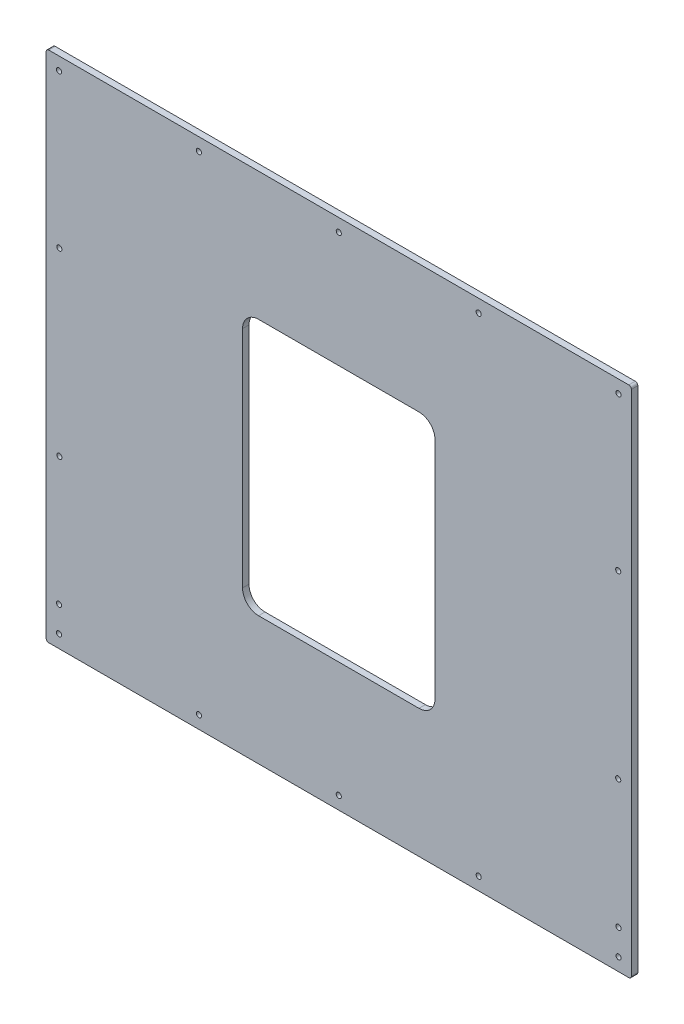
ISO-10303-21;
HEADER;
FILE_DESCRIPTION(('STEP AP214'),'2;1');
FILE_NAME('part.step','',(''),(''),'','','');
FILE_SCHEMA(('AUTOMOTIVE_DESIGN { 1 0 10303 214 1 1 1 1 }'));
ENDSEC;
DATA;
#1=APPLICATION_CONTEXT('core data for automotive mechanical design processes');
#2=APPLICATION_PROTOCOL_DEFINITION('international standard','automotive_design',2000,#1);
#3=PRODUCT_CONTEXT('',#1,'mechanical');
#4=PRODUCT('Part','Part','',(#3));
#5=PRODUCT_RELATED_PRODUCT_CATEGORY('part','',(#4));
#6=PRODUCT_DEFINITION_FORMATION('','',#4);
#7=PRODUCT_DEFINITION_CONTEXT('part definition',#1,'design');
#8=PRODUCT_DEFINITION('design','',#6,#7);
#9=PRODUCT_DEFINITION_SHAPE('','',#8);
#10=(LENGTH_UNIT() NAMED_UNIT(*) SI_UNIT(.MILLI.,.METRE.));
#11=(NAMED_UNIT(*) PLANE_ANGLE_UNIT() SI_UNIT($,.RADIAN.));
#12=(NAMED_UNIT(*) SI_UNIT($,.STERADIAN.) SOLID_ANGLE_UNIT());
#13=UNCERTAINTY_MEASURE_WITH_UNIT(LENGTH_MEASURE(1.E-05),#10,'distance_accuracy_value','');
#14=(GEOMETRIC_REPRESENTATION_CONTEXT(3) GLOBAL_UNCERTAINTY_ASSIGNED_CONTEXT((#13)) GLOBAL_UNIT_ASSIGNED_CONTEXT((#10,
#11,#12)) REPRESENTATION_CONTEXT('',''));
#15=CARTESIAN_POINT('',(0.,0.,0.));
#16=DIRECTION('',(0.,0.,1.));
#17=DIRECTION('',(1.,0.,0.));
#18=AXIS2_PLACEMENT_3D('',#15,#16,#17);
#19=CARTESIAN_POINT('',(-452.,396.,10.));
#20=DIRECTION('',(0.,0.,-1.));
#21=DIRECTION('',(-1.,0.,0.));
#22=AXIS2_PLACEMENT_3D('',#19,#20,#21);
#23=PLANE('',#22);
#24=DIRECTION('',(0.,-1.,0.));
#25=VECTOR('',#24,1.);
#26=CARTESIAN_POINT('',(-150.,-175.,10.));
#27=LINE('',#26,#25);
#28=CARTESIAN_POINT('',(-150.,175.,10.));
#29=VERTEX_POINT('',#28);
#30=CARTESIAN_POINT('',(-150.,-175.,10.));
#31=VERTEX_POINT('',#30);
#32=EDGE_CURVE('E184',#29,#31,#27,.T.);
#33=ORIENTED_EDGE('',*,*,#32,.F.);
#34=CARTESIAN_POINT('',(-125.,175.,10.));
#35=DIRECTION('',(0.,0.,1.));
#36=DIRECTION('',(1.,0.,0.));
#37=AXIS2_PLACEMENT_3D('',#34,#35,#36);
#38=CIRCLE('',#37,25.);
#39=CARTESIAN_POINT('',(-125.,200.,10.));
#40=VERTEX_POINT('',#39);
#41=EDGE_CURVE('E47',#40,#29,#38,.T.);
#42=ORIENTED_EDGE('',*,*,#41,.F.);
#43=DIRECTION('',(-1.,0.,0.));
#44=VECTOR('',#43,1.);
#45=CARTESIAN_POINT('',(-125.,200.,10.));
#46=LINE('',#45,#44);
#47=CARTESIAN_POINT('',(125.,200.,10.));
#48=VERTEX_POINT('',#47);
#49=EDGE_CURVE('E164',#48,#40,#46,.T.);
#50=ORIENTED_EDGE('',*,*,#49,.F.);
#51=CARTESIAN_POINT('',(125.,175.,10.));
#52=DIRECTION('',(0.,0.,1.));
#53=DIRECTION('',(-1.,0.,0.));
#54=AXIS2_PLACEMENT_3D('',#51,#52,#53);
#55=CIRCLE('',#54,25.);
#56=CARTESIAN_POINT('',(150.,175.,10.));
#57=VERTEX_POINT('',#56);
#58=EDGE_CURVE('E167',#57,#48,#55,.T.);
#59=ORIENTED_EDGE('',*,*,#58,.F.);
#60=DIRECTION('',(0.,1.,0.));
#61=VECTOR('',#60,1.);
#62=CARTESIAN_POINT('',(150.,-175.,10.));
#63=LINE('',#62,#61);
#64=CARTESIAN_POINT('',(150.,-175.,10.));
#65=VERTEX_POINT('',#64);
#66=EDGE_CURVE('E195',#65,#57,#63,.T.);
#67=ORIENTED_EDGE('',*,*,#66,.F.);
#68=CARTESIAN_POINT('',(125.,-175.,10.));
#69=DIRECTION('',(0.,0.,1.));
#70=DIRECTION('',(-1.,0.,0.));
#71=AXIS2_PLACEMENT_3D('',#68,#69,#70);
#72=CIRCLE('',#71,25.);
#73=CARTESIAN_POINT('',(125.,-200.,10.));
#74=VERTEX_POINT('',#73);
#75=EDGE_CURVE('E192',#74,#65,#72,.T.);
#76=ORIENTED_EDGE('',*,*,#75,.F.);
#77=DIRECTION('',(1.,0.,0.));
#78=VECTOR('',#77,1.);
#79=CARTESIAN_POINT('',(-125.,-200.,10.));
#80=LINE('',#79,#78);
#81=CARTESIAN_POINT('',(-125.,-200.,10.));
#82=VERTEX_POINT('',#81);
#83=EDGE_CURVE('E189',#82,#74,#80,.T.);
#84=ORIENTED_EDGE('',*,*,#83,.F.);
#85=CARTESIAN_POINT('',(-125.,-175.,10.));
#86=DIRECTION('',(0.,0.,1.));
#87=DIRECTION('',(1.,0.,0.));
#88=AXIS2_PLACEMENT_3D('',#85,#86,#87);
#89=CIRCLE('',#88,25.);
#90=EDGE_CURVE('E186',#31,#82,#89,.T.);
#91=ORIENTED_EDGE('',*,*,#90,.F.);
#92=EDGE_LOOP('',(#33,#42,#50,#59,#67,#76,#84,#91));
#93=FACE_BOUND('',#92,.T.);
#94=CARTESIAN_POINT('',(-452.,396.,10.));
#95=DIRECTION('',(0.,0.,1.));
#96=DIRECTION('',(-1.,0.,0.));
#97=AXIS2_PLACEMENT_3D('',#94,#95,#96);
#98=CIRCLE('',#97,4.);
#99=CARTESIAN_POINT('',(-452.,400.,10.));
#100=VERTEX_POINT('',#99);
#101=CARTESIAN_POINT('',(-456.,396.,10.));
#102=VERTEX_POINT('',#101);
#103=EDGE_CURVE('E310',#100,#102,#98,.T.);
#104=ORIENTED_EDGE('',*,*,#103,.T.);
#105=DIRECTION('',(0.,-1.,0.));
#106=VECTOR('',#105,1.);
#107=CARTESIAN_POINT('',(-456.,-396.,10.));
#108=LINE('',#107,#106);
#109=CARTESIAN_POINT('',(-456.,-396.,10.));
#110=VERTEX_POINT('',#109);
#111=EDGE_CURVE('E313',#102,#110,#108,.T.);
#112=ORIENTED_EDGE('',*,*,#111,.T.);
#113=CARTESIAN_POINT('',(-452.,-396.,10.));
#114=DIRECTION('',(0.,0.,1.));
#115=DIRECTION('',(1.,0.,0.));
#116=AXIS2_PLACEMENT_3D('',#113,#114,#115);
#117=CIRCLE('',#116,4.);
#118=CARTESIAN_POINT('',(-452.,-400.,10.));
#119=VERTEX_POINT('',#118);
#120=EDGE_CURVE('E316',#110,#119,#117,.T.);
#121=ORIENTED_EDGE('',*,*,#120,.T.);
#122=DIRECTION('',(1.,0.,0.));
#123=VECTOR('',#122,1.);
#124=CARTESIAN_POINT('',(-452.,-400.,10.));
#125=LINE('',#124,#123);
#126=CARTESIAN_POINT('',(452.,-400.,10.));
#127=VERTEX_POINT('',#126);
#128=EDGE_CURVE('E318',#119,#127,#125,.T.);
#129=ORIENTED_EDGE('',*,*,#128,.T.);
#130=CARTESIAN_POINT('',(452.,-396.,10.));
#131=DIRECTION('',(0.,0.,1.));
#132=DIRECTION('',(1.,0.,0.));
#133=AXIS2_PLACEMENT_3D('',#130,#131,#132);
#134=CIRCLE('',#133,4.);
#135=CARTESIAN_POINT('',(456.,-396.,10.));
#136=VERTEX_POINT('',#135);
#137=EDGE_CURVE('E320',#127,#136,#134,.T.);
#138=ORIENTED_EDGE('',*,*,#137,.T.);
#139=DIRECTION('',(0.,1.,0.));
#140=VECTOR('',#139,1.);
#141=CARTESIAN_POINT('',(456.,-396.,10.));
#142=LINE('',#141,#140);
#143=CARTESIAN_POINT('',(456.,396.,10.));
#144=VERTEX_POINT('',#143);
#145=EDGE_CURVE('E322',#136,#144,#142,.T.);
#146=ORIENTED_EDGE('',*,*,#145,.T.);
#147=CARTESIAN_POINT('',(452.,396.,10.));
#148=DIRECTION('',(0.,0.,1.));
#149=DIRECTION('',(1.,0.,0.));
#150=AXIS2_PLACEMENT_3D('',#147,#148,#149);
#151=CIRCLE('',#150,4.);
#152=CARTESIAN_POINT('',(452.,400.,10.));
#153=VERTEX_POINT('',#152);
#154=EDGE_CURVE('E324',#144,#153,#151,.T.);
#155=ORIENTED_EDGE('',*,*,#154,.T.);
#156=DIRECTION('',(-1.,0.,0.));
#157=VECTOR('',#156,1.);
#158=CARTESIAN_POINT('',(-452.,400.,10.));
#159=LINE('',#158,#157);
#160=EDGE_CURVE('E326',#153,#100,#159,.T.);
#161=ORIENTED_EDGE('',*,*,#160,.T.);
#162=EDGE_LOOP('',(#104,#112,#121,#129,#138,#146,#155,#161));
#163=FACE_BOUND('',#162,.T.);
#164=CARTESIAN_POINT('',(436.,380.,10.));
#165=DIRECTION('',(0.,0.,1.));
#166=DIRECTION('',(1.,0.,0.));
#167=AXIS2_PLACEMENT_3D('',#164,#165,#166);
#168=CIRCLE('',#167,3.99999999999999);
#169=CARTESIAN_POINT('',(440.,380.,10.));
#170=VERTEX_POINT('',#169);
#171=EDGE_CURVE('E304',#170,#170,#168,.T.);
#172=ORIENTED_EDGE('',*,*,#171,.F.);
#173=EDGE_LOOP('',(#172));
#174=FACE_BOUND('',#173,.T.);
#175=CARTESIAN_POINT('',(435.5,141.,10.));
#176=DIRECTION('',(0.,0.,1.));
#177=DIRECTION('',(1.,0.,0.));
#178=AXIS2_PLACEMENT_3D('',#175,#176,#177);
#179=CIRCLE('',#178,3.99999999999999);
#180=CARTESIAN_POINT('',(439.5,141.,10.));
#181=VERTEX_POINT('',#180);
#182=EDGE_CURVE('E298',#181,#181,#179,.T.);
#183=ORIENTED_EDGE('',*,*,#182,.F.);
#184=EDGE_LOOP('',(#183));
#185=FACE_BOUND('',#184,.T.);
#186=CARTESIAN_POINT('',(435.500000000003,-140.,10.));
#187=DIRECTION('',(0.,0.,1.));
#188=DIRECTION('',(1.,0.,0.));
#189=AXIS2_PLACEMENT_3D('',#186,#187,#188);
#190=CIRCLE('',#189,3.99999999999999);
#191=CARTESIAN_POINT('',(439.500000000003,-140.,10.));
#192=VERTEX_POINT('',#191);
#193=EDGE_CURVE('E292',#192,#192,#190,.T.);
#194=ORIENTED_EDGE('',*,*,#193,.F.);
#195=EDGE_LOOP('',(#194));
#196=FACE_BOUND('',#195,.T.);
#197=CARTESIAN_POINT('',(-435.500000000003,-140.,10.));
#198=DIRECTION('',(0.,0.,1.));
#199=DIRECTION('',(-1.,0.,0.));
#200=AXIS2_PLACEMENT_3D('',#197,#198,#199);
#201=CIRCLE('',#200,3.99999999999999);
#202=CARTESIAN_POINT('',(-439.500000000003,-140.,10.));
#203=VERTEX_POINT('',#202);
#204=EDGE_CURVE('E286',#203,#203,#201,.T.);
#205=ORIENTED_EDGE('',*,*,#204,.F.);
#206=EDGE_LOOP('',(#205));
#207=FACE_BOUND('',#206,.T.);
#208=CARTESIAN_POINT('',(-436.,380.,10.));
#209=DIRECTION('',(0.,0.,1.));
#210=DIRECTION('',(-1.,0.,0.));
#211=AXIS2_PLACEMENT_3D('',#208,#209,#210);
#212=CIRCLE('',#211,3.99999999999999);
#213=CARTESIAN_POINT('',(-440.,380.,10.));
#214=VERTEX_POINT('',#213);
#215=EDGE_CURVE('E280',#214,#214,#212,.T.);
#216=ORIENTED_EDGE('',*,*,#215,.F.);
#217=EDGE_LOOP('',(#216));
#218=FACE_BOUND('',#217,.T.);
#219=CARTESIAN_POINT('',(-435.5,141.,10.));
#220=DIRECTION('',(0.,0.,1.));
#221=DIRECTION('',(-1.,0.,0.));
#222=AXIS2_PLACEMENT_3D('',#219,#220,#221);
#223=CIRCLE('',#222,3.99999999999999);
#224=CARTESIAN_POINT('',(-439.5,141.,10.));
#225=VERTEX_POINT('',#224);
#226=EDGE_CURVE('E274',#225,#225,#223,.T.);
#227=ORIENTED_EDGE('',*,*,#226,.F.);
#228=EDGE_LOOP('',(#227));
#229=FACE_BOUND('',#228,.T.);
#230=CARTESIAN_POINT('',(436.,-380.,10.));
#231=DIRECTION('',(0.,0.,1.));
#232=DIRECTION('',(-1.,0.,0.));
#233=AXIS2_PLACEMENT_3D('',#230,#231,#232);
#234=CIRCLE('',#233,3.99999999999999);
#235=CARTESIAN_POINT('',(432.,-380.,10.));
#236=VERTEX_POINT('',#235);
#237=EDGE_CURVE('E268',#236,#236,#234,.T.);
#238=ORIENTED_EDGE('',*,*,#237,.F.);
#239=EDGE_LOOP('',(#238));
#240=FACE_BOUND('',#239,.T.);
#241=CARTESIAN_POINT('',(436.,-340.,10.));
#242=DIRECTION('',(0.,0.,1.));
#243=DIRECTION('',(-1.,0.,0.));
#244=AXIS2_PLACEMENT_3D('',#241,#242,#243);
#245=CIRCLE('',#244,3.99999999999999);
#246=CARTESIAN_POINT('',(432.,-340.,10.));
#247=VERTEX_POINT('',#246);
#248=EDGE_CURVE('E262',#247,#247,#245,.T.);
#249=ORIENTED_EDGE('',*,*,#248,.F.);
#250=EDGE_LOOP('',(#249));
#251=FACE_BOUND('',#250,.T.);
#252=CARTESIAN_POINT('',(-435.999999999999,-340.,10.));
#253=DIRECTION('',(0.,0.,1.));
#254=DIRECTION('',(1.,0.,0.));
#255=AXIS2_PLACEMENT_3D('',#252,#253,#254);
#256=CIRCLE('',#255,3.99999999999999);
#257=CARTESIAN_POINT('',(-431.999999999999,-340.,10.));
#258=VERTEX_POINT('',#257);
#259=EDGE_CURVE('E256',#258,#258,#256,.T.);
#260=ORIENTED_EDGE('',*,*,#259,.F.);
#261=EDGE_LOOP('',(#260));
#262=FACE_BOUND('',#261,.T.);
#263=CARTESIAN_POINT('',(-435.999999999999,-380.,10.));
#264=DIRECTION('',(0.,0.,1.));
#265=DIRECTION('',(1.,0.,0.));
#266=AXIS2_PLACEMENT_3D('',#263,#264,#265);
#267=CIRCLE('',#266,3.99999999999999);
#268=CARTESIAN_POINT('',(-431.999999999999,-380.,10.));
#269=VERTEX_POINT('',#268);
#270=EDGE_CURVE('E250',#269,#269,#267,.T.);
#271=ORIENTED_EDGE('',*,*,#270,.F.);
#272=EDGE_LOOP('',(#271));
#273=FACE_BOUND('',#272,.T.);
#274=CARTESIAN_POINT('',(-218.,380.000000000005,10.));
#275=DIRECTION('',(0.,0.,1.));
#276=DIRECTION('',(1.,0.,0.));
#277=AXIS2_PLACEMENT_3D('',#274,#275,#276);
#278=CIRCLE('',#277,3.99999999999999);
#279=CARTESIAN_POINT('',(-214.,380.000000000005,10.));
#280=VERTEX_POINT('',#279);
#281=EDGE_CURVE('E244',#280,#280,#278,.T.);
#282=ORIENTED_EDGE('',*,*,#281,.F.);
#283=EDGE_LOOP('',(#282));
#284=FACE_BOUND('',#283,.T.);
#285=CARTESIAN_POINT('',(218.,-380.000000000002,10.));
#286=DIRECTION('',(0.,0.,1.));
#287=DIRECTION('',(-1.,0.,0.));
#288=AXIS2_PLACEMENT_3D('',#285,#286,#287);
#289=CIRCLE('',#288,3.99999999999999);
#290=CARTESIAN_POINT('',(214.,-380.000000000002,10.));
#291=VERTEX_POINT('',#290);
#292=EDGE_CURVE('E238',#291,#291,#289,.T.);
#293=ORIENTED_EDGE('',*,*,#292,.F.);
#294=EDGE_LOOP('',(#293));
#295=FACE_BOUND('',#294,.T.);
#296=CARTESIAN_POINT('',(-2.22044604925031E-13,-380.000000000003,10.));
#297=DIRECTION('',(0.,0.,1.));
#298=DIRECTION('',(-1.,0.,0.));
#299=AXIS2_PLACEMENT_3D('',#296,#297,#298);
#300=CIRCLE('',#299,3.99999999999999);
#301=CARTESIAN_POINT('',(-4.00000000000021,-380.000000000003,10.));
#302=VERTEX_POINT('',#301);
#303=EDGE_CURVE('E232',#302,#302,#300,.T.);
#304=ORIENTED_EDGE('',*,*,#303,.F.);
#305=EDGE_LOOP('',(#304));
#306=FACE_BOUND('',#305,.T.);
#307=CARTESIAN_POINT('',(-218.,-380.000000000005,10.));
#308=DIRECTION('',(0.,0.,1.));
#309=DIRECTION('',(-1.,0.,0.));
#310=AXIS2_PLACEMENT_3D('',#307,#308,#309);
#311=CIRCLE('',#310,3.99999999999999);
#312=CARTESIAN_POINT('',(-222.,-380.000000000005,10.));
#313=VERTEX_POINT('',#312);
#314=EDGE_CURVE('E226',#313,#313,#311,.T.);
#315=ORIENTED_EDGE('',*,*,#314,.F.);
#316=EDGE_LOOP('',(#315));
#317=FACE_BOUND('',#316,.T.);
#318=CARTESIAN_POINT('',(-4.44089209850063E-13,380.000000000003,10.));
#319=DIRECTION('',(0.,0.,1.));
#320=DIRECTION('',(1.,0.,0.));
#321=AXIS2_PLACEMENT_3D('',#318,#319,#320);
#322=CIRCLE('',#321,3.99999999999999);
#323=CARTESIAN_POINT('',(3.99999999999955,380.000000000003,10.));
#324=VERTEX_POINT('',#323);
#325=EDGE_CURVE('E220',#324,#324,#322,.T.);
#326=ORIENTED_EDGE('',*,*,#325,.F.);
#327=EDGE_LOOP('',(#326));
#328=FACE_BOUND('',#327,.T.);
#329=CARTESIAN_POINT('',(217.999999999999,380.000000000002,10.));
#330=DIRECTION('',(0.,0.,1.));
#331=DIRECTION('',(1.,0.,0.));
#332=AXIS2_PLACEMENT_3D('',#329,#330,#331);
#333=CIRCLE('',#332,3.99999999999999);
#334=CARTESIAN_POINT('',(221.999999999999,380.000000000002,10.));
#335=VERTEX_POINT('',#334);
#336=EDGE_CURVE('E214',#335,#335,#333,.T.);
#337=ORIENTED_EDGE('',*,*,#336,.F.);
#338=EDGE_LOOP('',(#337));
#339=FACE_BOUND('',#338,.T.);
#340=ADVANCED_FACE('F32',(#93,#163,#174,#185,#196,#207,#218,#229,#240,#251,#262,#273,#284,#295,
#306,#317,#328,#339),#23,.F.);
#341=CARTESIAN_POINT('',(-452.,396.,0.));
#342=DIRECTION('',(0.,0.,-1.));
#343=DIRECTION('',(-1.,0.,0.));
#344=AXIS2_PLACEMENT_3D('',#341,#342,#343);
#345=PLANE('',#344);
#346=CARTESIAN_POINT('',(-125.,175.,0.));
#347=DIRECTION('',(0.,0.,1.));
#348=DIRECTION('',(1.,0.,0.));
#349=AXIS2_PLACEMENT_3D('',#346,#347,#348);
#350=CIRCLE('',#349,25.);
#351=CARTESIAN_POINT('',(-125.,200.,0.));
#352=VERTEX_POINT('',#351);
#353=CARTESIAN_POINT('',(-150.,175.,0.));
#354=VERTEX_POINT('',#353);
#355=EDGE_CURVE('E147',#352,#354,#350,.T.);
#356=ORIENTED_EDGE('',*,*,#355,.T.);
#357=DIRECTION('',(0.,-1.,0.));
#358=VECTOR('',#357,1.);
#359=CARTESIAN_POINT('',(-150.,-175.,0.));
#360=LINE('',#359,#358);
#361=CARTESIAN_POINT('',(-150.,-175.,0.));
#362=VERTEX_POINT('',#361);
#363=EDGE_CURVE('E156',#354,#362,#360,.T.);
#364=ORIENTED_EDGE('',*,*,#363,.T.);
#365=CARTESIAN_POINT('',(-125.,-175.,0.));
#366=DIRECTION('',(0.,0.,1.));
#367=DIRECTION('',(1.,0.,0.));
#368=AXIS2_PLACEMENT_3D('',#365,#366,#367);
#369=CIRCLE('',#368,25.);
#370=CARTESIAN_POINT('',(-125.,-200.,0.));
#371=VERTEX_POINT('',#370);
#372=EDGE_CURVE('E55',#362,#371,#369,.T.);
#373=ORIENTED_EDGE('',*,*,#372,.T.);
#374=DIRECTION('',(1.,0.,0.));
#375=VECTOR('',#374,1.);
#376=CARTESIAN_POINT('',(-125.,-200.,0.));
#377=LINE('',#376,#375);
#378=CARTESIAN_POINT('',(125.,-200.,0.));
#379=VERTEX_POINT('',#378);
#380=EDGE_CURVE('E171',#371,#379,#377,.T.);
#381=ORIENTED_EDGE('',*,*,#380,.T.);
#382=CARTESIAN_POINT('',(125.,-175.,0.));
#383=DIRECTION('',(0.,0.,1.));
#384=DIRECTION('',(-1.,0.,0.));
#385=AXIS2_PLACEMENT_3D('',#382,#383,#384);
#386=CIRCLE('',#385,25.);
#387=CARTESIAN_POINT('',(150.,-175.,0.));
#388=VERTEX_POINT('',#387);
#389=EDGE_CURVE('E174',#379,#388,#386,.T.);
#390=ORIENTED_EDGE('',*,*,#389,.T.);
#391=DIRECTION('',(0.,1.,0.));
#392=VECTOR('',#391,1.);
#393=CARTESIAN_POINT('',(150.,-175.,0.));
#394=LINE('',#393,#392);
#395=CARTESIAN_POINT('',(150.,175.,0.));
#396=VERTEX_POINT('',#395);
#397=EDGE_CURVE('E177',#388,#396,#394,.T.);
#398=ORIENTED_EDGE('',*,*,#397,.T.);
#399=CARTESIAN_POINT('',(125.,175.,0.));
#400=DIRECTION('',(0.,0.,1.));
#401=DIRECTION('',(-1.,0.,0.));
#402=AXIS2_PLACEMENT_3D('',#399,#400,#401);
#403=CIRCLE('',#402,25.);
#404=CARTESIAN_POINT('',(125.,200.,0.));
#405=VERTEX_POINT('',#404);
#406=EDGE_CURVE('E180',#396,#405,#403,.T.);
#407=ORIENTED_EDGE('',*,*,#406,.T.);
#408=DIRECTION('',(-1.,0.,0.));
#409=VECTOR('',#408,1.);
#410=CARTESIAN_POINT('',(-125.,200.,0.));
#411=LINE('',#410,#409);
#412=EDGE_CURVE('E153',#405,#352,#411,.T.);
#413=ORIENTED_EDGE('',*,*,#412,.T.);
#414=EDGE_LOOP('',(#356,#364,#373,#381,#390,#398,#407,#413));
#415=FACE_BOUND('',#414,.T.);
#416=CARTESIAN_POINT('',(-4.44089209850063E-13,380.000000000003,0.));
#417=DIRECTION('',(0.,0.,1.));
#418=DIRECTION('',(1.,0.,0.));
#419=AXIS2_PLACEMENT_3D('',#416,#417,#418);
#420=CIRCLE('',#419,3.99999999999999);
#421=CARTESIAN_POINT('',(3.99999999999955,380.000000000003,0.));
#422=VERTEX_POINT('',#421);
#423=EDGE_CURVE('E217',#422,#422,#420,.T.);
#424=ORIENTED_EDGE('',*,*,#423,.T.);
#425=EDGE_LOOP('',(#424));
#426=FACE_BOUND('',#425,.T.);
#427=CARTESIAN_POINT('',(-2.22044604925031E-13,-380.000000000003,0.));
#428=DIRECTION('',(0.,0.,1.));
#429=DIRECTION('',(-1.,0.,0.));
#430=AXIS2_PLACEMENT_3D('',#427,#428,#429);
#431=CIRCLE('',#430,3.99999999999999);
#432=CARTESIAN_POINT('',(-4.00000000000021,-380.000000000003,0.));
#433=VERTEX_POINT('',#432);
#434=EDGE_CURVE('E229',#433,#433,#431,.T.);
#435=ORIENTED_EDGE('',*,*,#434,.T.);
#436=EDGE_LOOP('',(#435));
#437=FACE_BOUND('',#436,.T.);
#438=CARTESIAN_POINT('',(-218.,380.000000000005,0.));
#439=DIRECTION('',(0.,0.,1.));
#440=DIRECTION('',(1.,0.,0.));
#441=AXIS2_PLACEMENT_3D('',#438,#439,#440);
#442=CIRCLE('',#441,3.99999999999999);
#443=CARTESIAN_POINT('',(-214.,380.000000000005,0.));
#444=VERTEX_POINT('',#443);
#445=EDGE_CURVE('E241',#444,#444,#442,.T.);
#446=ORIENTED_EDGE('',*,*,#445,.T.);
#447=EDGE_LOOP('',(#446));
#448=FACE_BOUND('',#447,.T.);
#449=CARTESIAN_POINT('',(-435.999999999999,-340.,0.));
#450=DIRECTION('',(0.,0.,1.));
#451=DIRECTION('',(1.,0.,0.));
#452=AXIS2_PLACEMENT_3D('',#449,#450,#451);
#453=CIRCLE('',#452,3.99999999999999);
#454=CARTESIAN_POINT('',(-431.999999999999,-340.,0.));
#455=VERTEX_POINT('',#454);
#456=EDGE_CURVE('E253',#455,#455,#453,.T.);
#457=ORIENTED_EDGE('',*,*,#456,.T.);
#458=EDGE_LOOP('',(#457));
#459=FACE_BOUND('',#458,.T.);
#460=CARTESIAN_POINT('',(436.,-380.,0.));
#461=DIRECTION('',(0.,0.,1.));
#462=DIRECTION('',(-1.,0.,0.));
#463=AXIS2_PLACEMENT_3D('',#460,#461,#462);
#464=CIRCLE('',#463,3.99999999999999);
#465=CARTESIAN_POINT('',(432.,-380.,0.));
#466=VERTEX_POINT('',#465);
#467=EDGE_CURVE('E265',#466,#466,#464,.T.);
#468=ORIENTED_EDGE('',*,*,#467,.T.);
#469=EDGE_LOOP('',(#468));
#470=FACE_BOUND('',#469,.T.);
#471=CARTESIAN_POINT('',(-436.,380.,0.));
#472=DIRECTION('',(0.,0.,1.));
#473=DIRECTION('',(-1.,0.,0.));
#474=AXIS2_PLACEMENT_3D('',#471,#472,#473);
#475=CIRCLE('',#474,3.99999999999999);
#476=CARTESIAN_POINT('',(-440.,380.,0.));
#477=VERTEX_POINT('',#476);
#478=EDGE_CURVE('E277',#477,#477,#475,.T.);
#479=ORIENTED_EDGE('',*,*,#478,.T.);
#480=EDGE_LOOP('',(#479));
#481=FACE_BOUND('',#480,.T.);
#482=CARTESIAN_POINT('',(435.500000000003,-140.,0.));
#483=DIRECTION('',(0.,0.,1.));
#484=DIRECTION('',(1.,0.,0.));
#485=AXIS2_PLACEMENT_3D('',#482,#483,#484);
#486=CIRCLE('',#485,3.99999999999999);
#487=CARTESIAN_POINT('',(439.500000000003,-140.,0.));
#488=VERTEX_POINT('',#487);
#489=EDGE_CURVE('E289',#488,#488,#486,.T.);
#490=ORIENTED_EDGE('',*,*,#489,.T.);
#491=EDGE_LOOP('',(#490));
#492=FACE_BOUND('',#491,.T.);
#493=CARTESIAN_POINT('',(436.,380.,0.));
#494=DIRECTION('',(0.,0.,1.));
#495=DIRECTION('',(1.,0.,0.));
#496=AXIS2_PLACEMENT_3D('',#493,#494,#495);
#497=CIRCLE('',#496,3.99999999999999);
#498=CARTESIAN_POINT('',(440.,380.,0.));
#499=VERTEX_POINT('',#498);
#500=EDGE_CURVE('E301',#499,#499,#497,.T.);
#501=ORIENTED_EDGE('',*,*,#500,.T.);
#502=EDGE_LOOP('',(#501));
#503=FACE_BOUND('',#502,.T.);
#504=CARTESIAN_POINT('',(-452.,396.,0.));
#505=DIRECTION('',(0.,0.,1.));
#506=DIRECTION('',(-1.,0.,0.));
#507=AXIS2_PLACEMENT_3D('',#504,#505,#506);
#508=CIRCLE('',#507,4.);
#509=CARTESIAN_POINT('',(-452.,400.,0.));
#510=VERTEX_POINT('',#509);
#511=CARTESIAN_POINT('',(-456.,396.,0.));
#512=VERTEX_POINT('',#511);
#513=EDGE_CURVE('E307',#510,#512,#508,.T.);
#514=ORIENTED_EDGE('',*,*,#513,.F.);
#515=DIRECTION('',(-1.,0.,0.));
#516=VECTOR('',#515,1.);
#517=CARTESIAN_POINT('',(-452.,400.,0.));
#518=LINE('',#517,#516);
#519=CARTESIAN_POINT('',(452.,400.,0.));
#520=VERTEX_POINT('',#519);
#521=EDGE_CURVE('E314',#520,#510,#518,.T.);
#522=ORIENTED_EDGE('',*,*,#521,.F.);
#523=CARTESIAN_POINT('',(452.,396.,0.));
#524=DIRECTION('',(0.,0.,1.));
#525=DIRECTION('',(1.,0.,0.));
#526=AXIS2_PLACEMENT_3D('',#523,#524,#525);
#527=CIRCLE('',#526,4.);
#528=CARTESIAN_POINT('',(456.,396.,0.));
#529=VERTEX_POINT('',#528);
#530=EDGE_CURVE('E341',#529,#520,#527,.T.);
#531=ORIENTED_EDGE('',*,*,#530,.F.);
#532=DIRECTION('',(0.,1.,0.));
#533=VECTOR('',#532,1.);
#534=CARTESIAN_POINT('',(456.,-396.,0.));
#535=LINE('',#534,#533);
#536=CARTESIAN_POINT('',(456.,-396.,0.));
#537=VERTEX_POINT('',#536);
#538=EDGE_CURVE('E339',#537,#529,#535,.T.);
#539=ORIENTED_EDGE('',*,*,#538,.F.);
#540=CARTESIAN_POINT('',(452.,-396.,0.));
#541=DIRECTION('',(0.,0.,1.));
#542=DIRECTION('',(1.,0.,0.));
#543=AXIS2_PLACEMENT_3D('',#540,#541,#542);
#544=CIRCLE('',#543,4.);
#545=CARTESIAN_POINT('',(452.,-400.,0.));
#546=VERTEX_POINT('',#545);
#547=EDGE_CURVE('E337',#546,#537,#544,.T.);
#548=ORIENTED_EDGE('',*,*,#547,.F.);
#549=DIRECTION('',(1.,0.,0.));
#550=VECTOR('',#549,1.);
#551=CARTESIAN_POINT('',(-452.,-400.,0.));
#552=LINE('',#551,#550);
#553=CARTESIAN_POINT('',(-452.,-400.,0.));
#554=VERTEX_POINT('',#553);
#555=EDGE_CURVE('E335',#554,#546,#552,.T.);
#556=ORIENTED_EDGE('',*,*,#555,.F.);
#557=CARTESIAN_POINT('',(-452.,-396.,0.));
#558=DIRECTION('',(0.,0.,1.));
#559=DIRECTION('',(1.,0.,0.));
#560=AXIS2_PLACEMENT_3D('',#557,#558,#559);
#561=CIRCLE('',#560,4.);
#562=CARTESIAN_POINT('',(-456.,-396.,0.));
#563=VERTEX_POINT('',#562);
#564=EDGE_CURVE('E333',#563,#554,#561,.T.);
#565=ORIENTED_EDGE('',*,*,#564,.F.);
#566=DIRECTION('',(0.,-1.,0.));
#567=VECTOR('',#566,1.);
#568=CARTESIAN_POINT('',(-456.,-396.,0.));
#569=LINE('',#568,#567);
#570=EDGE_CURVE('E331',#512,#563,#569,.T.);
#571=ORIENTED_EDGE('',*,*,#570,.F.);
#572=EDGE_LOOP('',(#514,#522,#531,#539,#548,#556,#565,#571));
#573=FACE_BOUND('',#572,.T.);
#574=CARTESIAN_POINT('',(435.5,141.,0.));
#575=DIRECTION('',(0.,0.,1.));
#576=DIRECTION('',(1.,0.,0.));
#577=AXIS2_PLACEMENT_3D('',#574,#575,#576);
#578=CIRCLE('',#577,3.99999999999999);
#579=CARTESIAN_POINT('',(439.5,141.,0.));
#580=VERTEX_POINT('',#579);
#581=EDGE_CURVE('E295',#580,#580,#578,.T.);
#582=ORIENTED_EDGE('',*,*,#581,.T.);
#583=EDGE_LOOP('',(#582));
#584=FACE_BOUND('',#583,.T.);
#585=CARTESIAN_POINT('',(-435.500000000003,-140.,0.));
#586=DIRECTION('',(0.,0.,1.));
#587=DIRECTION('',(-1.,0.,0.));
#588=AXIS2_PLACEMENT_3D('',#585,#586,#587);
#589=CIRCLE('',#588,3.99999999999999);
#590=CARTESIAN_POINT('',(-439.500000000003,-140.,0.));
#591=VERTEX_POINT('',#590);
#592=EDGE_CURVE('E283',#591,#591,#589,.T.);
#593=ORIENTED_EDGE('',*,*,#592,.T.);
#594=EDGE_LOOP('',(#593));
#595=FACE_BOUND('',#594,.T.);
#596=CARTESIAN_POINT('',(-435.5,141.,0.));
#597=DIRECTION('',(0.,0.,1.));
#598=DIRECTION('',(-1.,0.,0.));
#599=AXIS2_PLACEMENT_3D('',#596,#597,#598);
#600=CIRCLE('',#599,3.99999999999999);
#601=CARTESIAN_POINT('',(-439.5,141.,0.));
#602=VERTEX_POINT('',#601);
#603=EDGE_CURVE('E271',#602,#602,#600,.T.);
#604=ORIENTED_EDGE('',*,*,#603,.T.);
#605=EDGE_LOOP('',(#604));
#606=FACE_BOUND('',#605,.T.);
#607=CARTESIAN_POINT('',(436.,-340.,0.));
#608=DIRECTION('',(0.,0.,1.));
#609=DIRECTION('',(-1.,0.,0.));
#610=AXIS2_PLACEMENT_3D('',#607,#608,#609);
#611=CIRCLE('',#610,3.99999999999999);
#612=CARTESIAN_POINT('',(432.,-340.,0.));
#613=VERTEX_POINT('',#612);
#614=EDGE_CURVE('E259',#613,#613,#611,.T.);
#615=ORIENTED_EDGE('',*,*,#614,.T.);
#616=EDGE_LOOP('',(#615));
#617=FACE_BOUND('',#616,.T.);
#618=CARTESIAN_POINT('',(-435.999999999999,-380.,0.));
#619=DIRECTION('',(0.,0.,1.));
#620=DIRECTION('',(1.,0.,0.));
#621=AXIS2_PLACEMENT_3D('',#618,#619,#620);
#622=CIRCLE('',#621,3.99999999999999);
#623=CARTESIAN_POINT('',(-431.999999999999,-380.,0.));
#624=VERTEX_POINT('',#623);
#625=EDGE_CURVE('E247',#624,#624,#622,.T.);
#626=ORIENTED_EDGE('',*,*,#625,.T.);
#627=EDGE_LOOP('',(#626));
#628=FACE_BOUND('',#627,.T.);
#629=CARTESIAN_POINT('',(218.,-380.000000000002,0.));
#630=DIRECTION('',(0.,0.,1.));
#631=DIRECTION('',(-1.,0.,0.));
#632=AXIS2_PLACEMENT_3D('',#629,#630,#631);
#633=CIRCLE('',#632,3.99999999999999);
#634=CARTESIAN_POINT('',(214.,-380.000000000002,0.));
#635=VERTEX_POINT('',#634);
#636=EDGE_CURVE('E235',#635,#635,#633,.T.);
#637=ORIENTED_EDGE('',*,*,#636,.T.);
#638=EDGE_LOOP('',(#637));
#639=FACE_BOUND('',#638,.T.);
#640=CARTESIAN_POINT('',(-218.,-380.000000000005,0.));
#641=DIRECTION('',(0.,0.,1.));
#642=DIRECTION('',(-1.,0.,0.));
#643=AXIS2_PLACEMENT_3D('',#640,#641,#642);
#644=CIRCLE('',#643,3.99999999999999);
#645=CARTESIAN_POINT('',(-222.,-380.000000000005,0.));
#646=VERTEX_POINT('',#645);
#647=EDGE_CURVE('E223',#646,#646,#644,.T.);
#648=ORIENTED_EDGE('',*,*,#647,.T.);
#649=EDGE_LOOP('',(#648));
#650=FACE_BOUND('',#649,.T.);
#651=CARTESIAN_POINT('',(217.999999999999,380.000000000002,0.));
#652=DIRECTION('',(0.,0.,1.));
#653=DIRECTION('',(1.,0.,0.));
#654=AXIS2_PLACEMENT_3D('',#651,#652,#653);
#655=CIRCLE('',#654,3.99999999999999);
#656=CARTESIAN_POINT('',(221.999999999999,380.000000000002,0.));
#657=VERTEX_POINT('',#656);
#658=EDGE_CURVE('E202',#657,#657,#655,.T.);
#659=ORIENTED_EDGE('',*,*,#658,.T.);
#660=EDGE_LOOP('',(#659));
#661=FACE_BOUND('',#660,.T.);
#662=ADVANCED_FACE('F160',(#415,#426,#437,#448,#459,#470,#481,#492,#503,#573,#584,#595,#606,
#617,#628,#639,#650,#661),#345,.T.);
#663=CARTESIAN_POINT('',(-452.,396.,10.));
#664=DIRECTION('',(0.,0.,-1.));
#665=DIRECTION('',(-1.,0.,0.));
#666=AXIS2_PLACEMENT_3D('',#663,#664,#665);
#667=CYLINDRICAL_SURFACE('',#666,4.);
#668=ORIENTED_EDGE('',*,*,#513,.T.);
#669=DIRECTION('',(0.,0.,-1.));
#670=VECTOR('',#669,1.);
#671=CARTESIAN_POINT('',(-456.,396.,10.));
#672=LINE('',#671,#670);
#673=EDGE_CURVE('E11',#102,#512,#672,.T.);
#674=ORIENTED_EDGE('',*,*,#673,.F.);
#675=ORIENTED_EDGE('',*,*,#103,.F.);
#676=DIRECTION('',(0.,0.,-1.));
#677=VECTOR('',#676,1.);
#678=CARTESIAN_POINT('',(-452.,400.,10.));
#679=LINE('',#678,#677);
#680=EDGE_CURVE('E328',#100,#510,#679,.T.);
#681=ORIENTED_EDGE('',*,*,#680,.T.);
#682=EDGE_LOOP('',(#668,#674,#675,#681));
#683=FACE_BOUND('',#682,.T.);
#684=ADVANCED_FACE('F34',(#683),#667,.T.);
#685=CARTESIAN_POINT('',(-456.,-396.,10.));
#686=DIRECTION('',(1.,0.,0.));
#687=DIRECTION('',(0.,0.,-1.));
#688=AXIS2_PLACEMENT_3D('',#685,#686,#687);
#689=PLANE('',#688);
#690=ORIENTED_EDGE('',*,*,#570,.T.);
#691=DIRECTION('',(0.,0.,-1.));
#692=VECTOR('',#691,1.);
#693=CARTESIAN_POINT('',(-456.,-396.,10.));
#694=LINE('',#693,#692);
#695=EDGE_CURVE('E40',#110,#563,#694,.T.);
#696=ORIENTED_EDGE('',*,*,#695,.F.);
#697=ORIENTED_EDGE('',*,*,#111,.F.);
#698=ORIENTED_EDGE('',*,*,#673,.T.);
#699=EDGE_LOOP('',(#690,#696,#697,#698));
#700=FACE_BOUND('',#699,.T.);
#701=ADVANCED_FACE('F388',(#700),#689,.F.);
#702=CARTESIAN_POINT('',(-452.,-396.,10.));
#703=DIRECTION('',(0.,0.,-1.));
#704=DIRECTION('',(-1.,0.,0.));
#705=AXIS2_PLACEMENT_3D('',#702,#703,#704);
#706=CYLINDRICAL_SURFACE('',#705,4.);
#707=ORIENTED_EDGE('',*,*,#564,.T.);
#708=DIRECTION('',(0.,0.,-1.));
#709=VECTOR('',#708,1.);
#710=CARTESIAN_POINT('',(-452.,-400.,10.));
#711=LINE('',#710,#709);
#712=EDGE_CURVE('E358',#119,#554,#711,.T.);
#713=ORIENTED_EDGE('',*,*,#712,.F.);
#714=ORIENTED_EDGE('',*,*,#120,.F.);
#715=ORIENTED_EDGE('',*,*,#695,.T.);
#716=EDGE_LOOP('',(#707,#713,#714,#715));
#717=FACE_BOUND('',#716,.T.);
#718=ADVANCED_FACE('F365',(#717),#706,.T.);
#719=CARTESIAN_POINT('',(-452.,-400.,10.));
#720=DIRECTION('',(0.,1.,0.));
#721=DIRECTION('',(0.,0.,1.));
#722=AXIS2_PLACEMENT_3D('',#719,#720,#721);
#723=PLANE('',#722);
#724=ORIENTED_EDGE('',*,*,#555,.T.);
#725=DIRECTION('',(0.,0.,-1.));
#726=VECTOR('',#725,1.);
#727=CARTESIAN_POINT('',(452.,-400.,10.));
#728=LINE('',#727,#726);
#729=EDGE_CURVE('E355',#127,#546,#728,.T.);
#730=ORIENTED_EDGE('',*,*,#729,.F.);
#731=ORIENTED_EDGE('',*,*,#128,.F.);
#732=ORIENTED_EDGE('',*,*,#712,.T.);
#733=EDGE_LOOP('',(#724,#730,#731,#732));
#734=FACE_BOUND('',#733,.T.);
#735=ADVANCED_FACE('F376',(#734),#723,.F.);
#736=CARTESIAN_POINT('',(452.,-396.,10.));
#737=DIRECTION('',(0.,0.,-1.));
#738=DIRECTION('',(-1.,0.,0.));
#739=AXIS2_PLACEMENT_3D('',#736,#737,#738);
#740=CYLINDRICAL_SURFACE('',#739,4.);
#741=ORIENTED_EDGE('',*,*,#547,.T.);
#742=DIRECTION('',(0.,0.,-1.));
#743=VECTOR('',#742,1.);
#744=CARTESIAN_POINT('',(456.,-396.,10.));
#745=LINE('',#744,#743);
#746=EDGE_CURVE('E352',#136,#537,#745,.T.);
#747=ORIENTED_EDGE('',*,*,#746,.F.);
#748=ORIENTED_EDGE('',*,*,#137,.F.);
#749=ORIENTED_EDGE('',*,*,#729,.T.);
#750=EDGE_LOOP('',(#741,#747,#748,#749));
#751=FACE_BOUND('',#750,.T.);
#752=ADVANCED_FACE('F380',(#751),#740,.T.);
#753=CARTESIAN_POINT('',(456.,-396.,10.));
#754=DIRECTION('',(-1.,0.,0.));
#755=DIRECTION('',(0.,0.,1.));
#756=AXIS2_PLACEMENT_3D('',#753,#754,#755);
#757=PLANE('',#756);
#758=ORIENTED_EDGE('',*,*,#538,.T.);
#759=DIRECTION('',(0.,0.,-1.));
#760=VECTOR('',#759,1.);
#761=CARTESIAN_POINT('',(456.,396.,10.));
#762=LINE('',#761,#760);
#763=EDGE_CURVE('E349',#144,#529,#762,.T.);
#764=ORIENTED_EDGE('',*,*,#763,.F.);
#765=ORIENTED_EDGE('',*,*,#145,.F.);
#766=ORIENTED_EDGE('',*,*,#746,.T.);
#767=EDGE_LOOP('',(#758,#764,#765,#766));
#768=FACE_BOUND('',#767,.T.);
#769=ADVANCED_FACE('F401',(#768),#757,.F.);
#770=CARTESIAN_POINT('',(452.,396.,10.));
#771=DIRECTION('',(0.,0.,-1.));
#772=DIRECTION('',(-1.,0.,0.));
#773=AXIS2_PLACEMENT_3D('',#770,#771,#772);
#774=CYLINDRICAL_SURFACE('',#773,4.);
#775=ORIENTED_EDGE('',*,*,#530,.T.);
#776=DIRECTION('',(0.,0.,-1.));
#777=VECTOR('',#776,1.);
#778=CARTESIAN_POINT('',(452.,400.,10.));
#779=LINE('',#778,#777);
#780=EDGE_CURVE('E346',#153,#520,#779,.T.);
#781=ORIENTED_EDGE('',*,*,#780,.F.);
#782=ORIENTED_EDGE('',*,*,#154,.F.);
#783=ORIENTED_EDGE('',*,*,#763,.T.);
#784=EDGE_LOOP('',(#775,#781,#782,#783));
#785=FACE_BOUND('',#784,.T.);
#786=ADVANCED_FACE('F399',(#785),#774,.T.);
#787=CARTESIAN_POINT('',(-452.,400.,10.));
#788=DIRECTION('',(0.,-1.,0.));
#789=DIRECTION('',(0.,0.,-1.));
#790=AXIS2_PLACEMENT_3D('',#787,#788,#789);
#791=PLANE('',#790);
#792=ORIENTED_EDGE('',*,*,#521,.T.);
#793=ORIENTED_EDGE('',*,*,#680,.F.);
#794=ORIENTED_EDGE('',*,*,#160,.F.);
#795=ORIENTED_EDGE('',*,*,#780,.T.);
#796=EDGE_LOOP('',(#792,#793,#794,#795));
#797=FACE_BOUND('',#796,.T.);
#798=ADVANCED_FACE('F394',(#797),#791,.F.);
#799=CARTESIAN_POINT('',(436.,380.,10.));
#800=DIRECTION('',(0.,0.,-1.));
#801=DIRECTION('',(-1.,0.,0.));
#802=AXIS2_PLACEMENT_3D('',#799,#800,#801);
#803=CYLINDRICAL_SURFACE('',#802,3.99999999999999);
#804=ORIENTED_EDGE('',*,*,#171,.T.);
#805=EDGE_LOOP('',(#804));
#806=FACE_BOUND('',#805,.T.);
#807=ORIENTED_EDGE('',*,*,#500,.F.);
#808=EDGE_LOOP('',(#807));
#809=FACE_BOUND('',#808,.T.);
#810=ADVANCED_FACE('F418',(#806,#809),#803,.F.);
#811=CARTESIAN_POINT('',(435.5,141.,10.));
#812=DIRECTION('',(0.,0.,-1.));
#813=DIRECTION('',(-1.,0.,0.));
#814=AXIS2_PLACEMENT_3D('',#811,#812,#813);
#815=CYLINDRICAL_SURFACE('',#814,3.99999999999999);
#816=ORIENTED_EDGE('',*,*,#182,.T.);
#817=EDGE_LOOP('',(#816));
#818=FACE_BOUND('',#817,.T.);
#819=ORIENTED_EDGE('',*,*,#581,.F.);
#820=EDGE_LOOP('',(#819));
#821=FACE_BOUND('',#820,.T.);
#822=ADVANCED_FACE('F425',(#818,#821),#815,.F.);
#823=CARTESIAN_POINT('',(435.500000000003,-140.,10.));
#824=DIRECTION('',(0.,0.,-1.));
#825=DIRECTION('',(-1.,0.,0.));
#826=AXIS2_PLACEMENT_3D('',#823,#824,#825);
#827=CYLINDRICAL_SURFACE('',#826,3.99999999999999);
#828=ORIENTED_EDGE('',*,*,#193,.T.);
#829=EDGE_LOOP('',(#828));
#830=FACE_BOUND('',#829,.T.);
#831=ORIENTED_EDGE('',*,*,#489,.F.);
#832=EDGE_LOOP('',(#831));
#833=FACE_BOUND('',#832,.T.);
#834=ADVANCED_FACE('F430',(#830,#833),#827,.F.);
#835=CARTESIAN_POINT('',(-435.500000000003,-140.,10.));
#836=DIRECTION('',(0.,0.,-1.));
#837=DIRECTION('',(-1.,0.,0.));
#838=AXIS2_PLACEMENT_3D('',#835,#836,#837);
#839=CYLINDRICAL_SURFACE('',#838,3.99999999999999);
#840=ORIENTED_EDGE('',*,*,#204,.T.);
#841=EDGE_LOOP('',(#840));
#842=FACE_BOUND('',#841,.T.);
#843=ORIENTED_EDGE('',*,*,#592,.F.);
#844=EDGE_LOOP('',(#843));
#845=FACE_BOUND('',#844,.T.);
#846=ADVANCED_FACE('F523',(#842,#845),#839,.F.);
#847=CARTESIAN_POINT('',(-436.,380.,10.));
#848=DIRECTION('',(0.,0.,-1.));
#849=DIRECTION('',(-1.,0.,0.));
#850=AXIS2_PLACEMENT_3D('',#847,#848,#849);
#851=CYLINDRICAL_SURFACE('',#850,3.99999999999999);
#852=ORIENTED_EDGE('',*,*,#215,.T.);
#853=EDGE_LOOP('',(#852));
#854=FACE_BOUND('',#853,.T.);
#855=ORIENTED_EDGE('',*,*,#478,.F.);
#856=EDGE_LOOP('',(#855));
#857=FACE_BOUND('',#856,.T.);
#858=ADVANCED_FACE('F519',(#854,#857),#851,.F.);
#859=CARTESIAN_POINT('',(-435.5,141.,10.));
#860=DIRECTION('',(0.,0.,-1.));
#861=DIRECTION('',(-1.,0.,0.));
#862=AXIS2_PLACEMENT_3D('',#859,#860,#861);
#863=CYLINDRICAL_SURFACE('',#862,3.99999999999999);
#864=ORIENTED_EDGE('',*,*,#226,.T.);
#865=EDGE_LOOP('',(#864));
#866=FACE_BOUND('',#865,.T.);
#867=ORIENTED_EDGE('',*,*,#603,.F.);
#868=EDGE_LOOP('',(#867));
#869=FACE_BOUND('',#868,.T.);
#870=ADVANCED_FACE('F515',(#866,#869),#863,.F.);
#871=CARTESIAN_POINT('',(436.,-380.,10.));
#872=DIRECTION('',(0.,0.,-1.));
#873=DIRECTION('',(-1.,0.,0.));
#874=AXIS2_PLACEMENT_3D('',#871,#872,#873);
#875=CYLINDRICAL_SURFACE('',#874,3.99999999999999);
#876=ORIENTED_EDGE('',*,*,#237,.T.);
#877=EDGE_LOOP('',(#876));
#878=FACE_BOUND('',#877,.T.);
#879=ORIENTED_EDGE('',*,*,#467,.F.);
#880=EDGE_LOOP('',(#879));
#881=FACE_BOUND('',#880,.T.);
#882=ADVANCED_FACE('F511',(#878,#881),#875,.F.);
#883=CARTESIAN_POINT('',(436.,-340.,10.));
#884=DIRECTION('',(0.,0.,-1.));
#885=DIRECTION('',(-1.,0.,0.));
#886=AXIS2_PLACEMENT_3D('',#883,#884,#885);
#887=CYLINDRICAL_SURFACE('',#886,3.99999999999999);
#888=ORIENTED_EDGE('',*,*,#248,.T.);
#889=EDGE_LOOP('',(#888));
#890=FACE_BOUND('',#889,.T.);
#891=ORIENTED_EDGE('',*,*,#614,.F.);
#892=EDGE_LOOP('',(#891));
#893=FACE_BOUND('',#892,.T.);
#894=ADVANCED_FACE('F507',(#890,#893),#887,.F.);
#895=CARTESIAN_POINT('',(-435.999999999999,-340.,10.));
#896=DIRECTION('',(0.,0.,-1.));
#897=DIRECTION('',(-1.,0.,0.));
#898=AXIS2_PLACEMENT_3D('',#895,#896,#897);
#899=CYLINDRICAL_SURFACE('',#898,3.99999999999999);
#900=ORIENTED_EDGE('',*,*,#259,.T.);
#901=EDGE_LOOP('',(#900));
#902=FACE_BOUND('',#901,.T.);
#903=ORIENTED_EDGE('',*,*,#456,.F.);
#904=EDGE_LOOP('',(#903));
#905=FACE_BOUND('',#904,.T.);
#906=ADVANCED_FACE('F503',(#902,#905),#899,.F.);
#907=CARTESIAN_POINT('',(-435.999999999999,-380.,10.));
#908=DIRECTION('',(0.,0.,-1.));
#909=DIRECTION('',(-1.,0.,0.));
#910=AXIS2_PLACEMENT_3D('',#907,#908,#909);
#911=CYLINDRICAL_SURFACE('',#910,3.99999999999999);
#912=ORIENTED_EDGE('',*,*,#270,.T.);
#913=EDGE_LOOP('',(#912));
#914=FACE_BOUND('',#913,.T.);
#915=ORIENTED_EDGE('',*,*,#625,.F.);
#916=EDGE_LOOP('',(#915));
#917=FACE_BOUND('',#916,.T.);
#918=ADVANCED_FACE('F499',(#914,#917),#911,.F.);
#919=CARTESIAN_POINT('',(-218.,380.000000000005,10.));
#920=DIRECTION('',(0.,0.,-1.));
#921=DIRECTION('',(-1.,0.,0.));
#922=AXIS2_PLACEMENT_3D('',#919,#920,#921);
#923=CYLINDRICAL_SURFACE('',#922,3.99999999999999);
#924=ORIENTED_EDGE('',*,*,#281,.T.);
#925=EDGE_LOOP('',(#924));
#926=FACE_BOUND('',#925,.T.);
#927=ORIENTED_EDGE('',*,*,#445,.F.);
#928=EDGE_LOOP('',(#927));
#929=FACE_BOUND('',#928,.T.);
#930=ADVANCED_FACE('F495',(#926,#929),#923,.F.);
#931=CARTESIAN_POINT('',(218.,-380.000000000002,10.));
#932=DIRECTION('',(0.,0.,-1.));
#933=DIRECTION('',(-1.,0.,0.));
#934=AXIS2_PLACEMENT_3D('',#931,#932,#933);
#935=CYLINDRICAL_SURFACE('',#934,3.99999999999999);
#936=ORIENTED_EDGE('',*,*,#292,.T.);
#937=EDGE_LOOP('',(#936));
#938=FACE_BOUND('',#937,.T.);
#939=ORIENTED_EDGE('',*,*,#636,.F.);
#940=EDGE_LOOP('',(#939));
#941=FACE_BOUND('',#940,.T.);
#942=ADVANCED_FACE('F491',(#938,#941),#935,.F.);
#943=CARTESIAN_POINT('',(-2.22044604925031E-13,-380.000000000003,10.));
#944=DIRECTION('',(0.,0.,-1.));
#945=DIRECTION('',(-1.,0.,0.));
#946=AXIS2_PLACEMENT_3D('',#943,#944,#945);
#947=CYLINDRICAL_SURFACE('',#946,3.99999999999999);
#948=ORIENTED_EDGE('',*,*,#303,.T.);
#949=EDGE_LOOP('',(#948));
#950=FACE_BOUND('',#949,.T.);
#951=ORIENTED_EDGE('',*,*,#434,.F.);
#952=EDGE_LOOP('',(#951));
#953=FACE_BOUND('',#952,.T.);
#954=ADVANCED_FACE('F487',(#950,#953),#947,.F.);
#955=CARTESIAN_POINT('',(-218.,-380.000000000005,10.));
#956=DIRECTION('',(0.,0.,-1.));
#957=DIRECTION('',(-1.,0.,0.));
#958=AXIS2_PLACEMENT_3D('',#955,#956,#957);
#959=CYLINDRICAL_SURFACE('',#958,3.99999999999999);
#960=ORIENTED_EDGE('',*,*,#314,.T.);
#961=EDGE_LOOP('',(#960));
#962=FACE_BOUND('',#961,.T.);
#963=ORIENTED_EDGE('',*,*,#647,.F.);
#964=EDGE_LOOP('',(#963));
#965=FACE_BOUND('',#964,.T.);
#966=ADVANCED_FACE('F480',(#962,#965),#959,.F.);
#967=CARTESIAN_POINT('',(-4.44089209850063E-13,380.000000000003,10.));
#968=DIRECTION('',(0.,0.,-1.));
#969=DIRECTION('',(-1.,0.,0.));
#970=AXIS2_PLACEMENT_3D('',#967,#968,#969);
#971=CYLINDRICAL_SURFACE('',#970,3.99999999999999);
#972=ORIENTED_EDGE('',*,*,#325,.T.);
#973=EDGE_LOOP('',(#972));
#974=FACE_BOUND('',#973,.T.);
#975=ORIENTED_EDGE('',*,*,#423,.F.);
#976=EDGE_LOOP('',(#975));
#977=FACE_BOUND('',#976,.T.);
#978=ADVANCED_FACE('F470',(#974,#977),#971,.F.);
#979=CARTESIAN_POINT('',(217.999999999999,380.000000000002,10.));
#980=DIRECTION('',(0.,0.,-1.));
#981=DIRECTION('',(-1.,0.,0.));
#982=AXIS2_PLACEMENT_3D('',#979,#980,#981);
#983=CYLINDRICAL_SURFACE('',#982,3.99999999999999);
#984=ORIENTED_EDGE('',*,*,#336,.T.);
#985=EDGE_LOOP('',(#984));
#986=FACE_BOUND('',#985,.T.);
#987=ORIENTED_EDGE('',*,*,#658,.F.);
#988=EDGE_LOOP('',(#987));
#989=FACE_BOUND('',#988,.T.);
#990=ADVANCED_FACE('F467',(#986,#989),#983,.F.);
#991=CARTESIAN_POINT('',(-125.,175.,0.));
#992=DIRECTION('',(0.,0.,1.));
#993=DIRECTION('',(1.,0.,0.));
#994=AXIS2_PLACEMENT_3D('',#991,#992,#993);
#995=CYLINDRICAL_SURFACE('',#994,25.);
#996=ORIENTED_EDGE('',*,*,#41,.T.);
#997=DIRECTION('',(0.,0.,1.));
#998=VECTOR('',#997,1.);
#999=CARTESIAN_POINT('',(-150.,175.,0.));
#1000=LINE('',#999,#998);
#1001=EDGE_CURVE('E143',#354,#29,#1000,.T.);
#1002=ORIENTED_EDGE('',*,*,#1001,.F.);
#1003=ORIENTED_EDGE('',*,*,#355,.F.);
#1004=DIRECTION('',(0.,0.,1.));
#1005=VECTOR('',#1004,1.);
#1006=CARTESIAN_POINT('',(-125.,200.,0.));
#1007=LINE('',#1006,#1005);
#1008=EDGE_CURVE('E200',#352,#40,#1007,.T.);
#1009=ORIENTED_EDGE('',*,*,#1008,.T.);
#1010=EDGE_LOOP('',(#996,#1002,#1003,#1009));
#1011=FACE_BOUND('',#1010,.T.);
#1012=ADVANCED_FACE('F145',(#1011),#995,.F.);
#1013=CARTESIAN_POINT('',(-125.,200.,0.));
#1014=DIRECTION('',(0.,1.,0.));
#1015=DIRECTION('',(0.,0.,1.));
#1016=AXIS2_PLACEMENT_3D('',#1013,#1014,#1015);
#1017=PLANE('',#1016);
#1018=ORIENTED_EDGE('',*,*,#49,.T.);
#1019=ORIENTED_EDGE('',*,*,#1008,.F.);
#1020=ORIENTED_EDGE('',*,*,#412,.F.);
#1021=DIRECTION('',(0.,0.,1.));
#1022=VECTOR('',#1021,1.);
#1023=CARTESIAN_POINT('',(125.,200.,0.));
#1024=LINE('',#1023,#1022);
#1025=EDGE_CURVE('E203',#405,#48,#1024,.T.);
#1026=ORIENTED_EDGE('',*,*,#1025,.T.);
#1027=EDGE_LOOP('',(#1018,#1019,#1020,#1026));
#1028=FACE_BOUND('',#1027,.T.);
#1029=ADVANCED_FACE('F478',(#1028),#1017,.F.);
#1030=CARTESIAN_POINT('',(125.,175.,0.));
#1031=DIRECTION('',(0.,0.,1.));
#1032=DIRECTION('',(1.,0.,0.));
#1033=AXIS2_PLACEMENT_3D('',#1030,#1031,#1032);
#1034=CYLINDRICAL_SURFACE('',#1033,25.);
#1035=ORIENTED_EDGE('',*,*,#58,.T.);
#1036=ORIENTED_EDGE('',*,*,#1025,.F.);
#1037=ORIENTED_EDGE('',*,*,#406,.F.);
#1038=DIRECTION('',(0.,0.,1.));
#1039=VECTOR('',#1038,1.);
#1040=CARTESIAN_POINT('',(150.,175.,0.));
#1041=LINE('',#1040,#1039);
#1042=EDGE_CURVE('E205',#396,#57,#1041,.T.);
#1043=ORIENTED_EDGE('',*,*,#1042,.T.);
#1044=EDGE_LOOP('',(#1035,#1036,#1037,#1043));
#1045=FACE_BOUND('',#1044,.T.);
#1046=ADVANCED_FACE('F616',(#1045),#1034,.F.);
#1047=CARTESIAN_POINT('',(150.,-175.,0.));
#1048=DIRECTION('',(1.,0.,0.));
#1049=DIRECTION('',(0.,1.,0.));
#1050=AXIS2_PLACEMENT_3D('',#1047,#1048,#1049);
#1051=PLANE('',#1050);
#1052=ORIENTED_EDGE('',*,*,#66,.T.);
#1053=ORIENTED_EDGE('',*,*,#1042,.F.);
#1054=ORIENTED_EDGE('',*,*,#397,.F.);
#1055=DIRECTION('',(0.,0.,1.));
#1056=VECTOR('',#1055,1.);
#1057=CARTESIAN_POINT('',(150.,-175.,0.));
#1058=LINE('',#1057,#1056);
#1059=EDGE_CURVE('E207',#388,#65,#1058,.T.);
#1060=ORIENTED_EDGE('',*,*,#1059,.T.);
#1061=EDGE_LOOP('',(#1052,#1053,#1054,#1060));
#1062=FACE_BOUND('',#1061,.T.);
#1063=ADVANCED_FACE('F626',(#1062),#1051,.F.);
#1064=CARTESIAN_POINT('',(125.,-175.,0.));
#1065=DIRECTION('',(0.,0.,1.));
#1066=DIRECTION('',(1.,0.,0.));
#1067=AXIS2_PLACEMENT_3D('',#1064,#1065,#1066);
#1068=CYLINDRICAL_SURFACE('',#1067,25.);
#1069=ORIENTED_EDGE('',*,*,#75,.T.);
#1070=ORIENTED_EDGE('',*,*,#1059,.F.);
#1071=ORIENTED_EDGE('',*,*,#389,.F.);
#1072=DIRECTION('',(0.,0.,1.));
#1073=VECTOR('',#1072,1.);
#1074=CARTESIAN_POINT('',(125.,-200.,0.));
#1075=LINE('',#1074,#1073);
#1076=EDGE_CURVE('E209',#379,#74,#1075,.T.);
#1077=ORIENTED_EDGE('',*,*,#1076,.T.);
#1078=EDGE_LOOP('',(#1069,#1070,#1071,#1077));
#1079=FACE_BOUND('',#1078,.T.);
#1080=ADVANCED_FACE('F636',(#1079),#1068,.F.);
#1081=CARTESIAN_POINT('',(-125.,-200.,0.));
#1082=DIRECTION('',(0.,-1.,0.));
#1083=DIRECTION('',(1.,0.,0.));
#1084=AXIS2_PLACEMENT_3D('',#1081,#1082,#1083);
#1085=PLANE('',#1084);
#1086=ORIENTED_EDGE('',*,*,#83,.T.);
#1087=ORIENTED_EDGE('',*,*,#1076,.F.);
#1088=ORIENTED_EDGE('',*,*,#380,.F.);
#1089=DIRECTION('',(0.,0.,1.));
#1090=VECTOR('',#1089,1.);
#1091=CARTESIAN_POINT('',(-125.,-200.,0.));
#1092=LINE('',#1091,#1090);
#1093=EDGE_CURVE('E211',#371,#82,#1092,.T.);
#1094=ORIENTED_EDGE('',*,*,#1093,.T.);
#1095=EDGE_LOOP('',(#1086,#1087,#1088,#1094));
#1096=FACE_BOUND('',#1095,.T.);
#1097=ADVANCED_FACE('F646',(#1096),#1085,.F.);
#1098=CARTESIAN_POINT('',(-125.,-175.,0.));
#1099=DIRECTION('',(0.,0.,1.));
#1100=DIRECTION('',(1.,0.,0.));
#1101=AXIS2_PLACEMENT_3D('',#1098,#1099,#1100);
#1102=CYLINDRICAL_SURFACE('',#1101,25.);
#1103=ORIENTED_EDGE('',*,*,#90,.T.);
#1104=ORIENTED_EDGE('',*,*,#1093,.F.);
#1105=ORIENTED_EDGE('',*,*,#372,.F.);
#1106=DIRECTION('',(0.,0.,1.));
#1107=VECTOR('',#1106,1.);
#1108=CARTESIAN_POINT('',(-150.,-175.,0.));
#1109=LINE('',#1108,#1107);
#1110=EDGE_CURVE('E152',#362,#31,#1109,.T.);
#1111=ORIENTED_EDGE('',*,*,#1110,.T.);
#1112=EDGE_LOOP('',(#1103,#1104,#1105,#1111));
#1113=FACE_BOUND('',#1112,.T.);
#1114=ADVANCED_FACE('F656',(#1113),#1102,.F.);
#1115=CARTESIAN_POINT('',(-150.,-175.,0.));
#1116=DIRECTION('',(-1.,0.,0.));
#1117=DIRECTION('',(0.,0.,1.));
#1118=AXIS2_PLACEMENT_3D('',#1115,#1116,#1117);
#1119=PLANE('',#1118);
#1120=ORIENTED_EDGE('',*,*,#32,.T.);
#1121=ORIENTED_EDGE('',*,*,#1110,.F.);
#1122=ORIENTED_EDGE('',*,*,#363,.F.);
#1123=ORIENTED_EDGE('',*,*,#1001,.T.);
#1124=EDGE_LOOP('',(#1120,#1121,#1122,#1123));
#1125=FACE_BOUND('',#1124,.T.);
#1126=ADVANCED_FACE('F157',(#1125),#1119,.F.);
#1127=CLOSED_SHELL('',(#340,#662,#684,#701,#718,#735,#752,#769,#786,#798,#810,#822,#834,#846,
#858,#870,#882,#894,#906,#918,#930,#942,#954,#966,#978,#990,#1012,#1029,#1046,#1063,#1080,#1097,
#1114,#1126));
#1128=MANIFOLD_SOLID_BREP('B2',#1127);
#1129=ADVANCED_BREP_SHAPE_REPRESENTATION('',(#18,#1128),#14);
#1130=SHAPE_DEFINITION_REPRESENTATION(#9,#1129);
ENDSEC;
END-ISO-10303-21;
